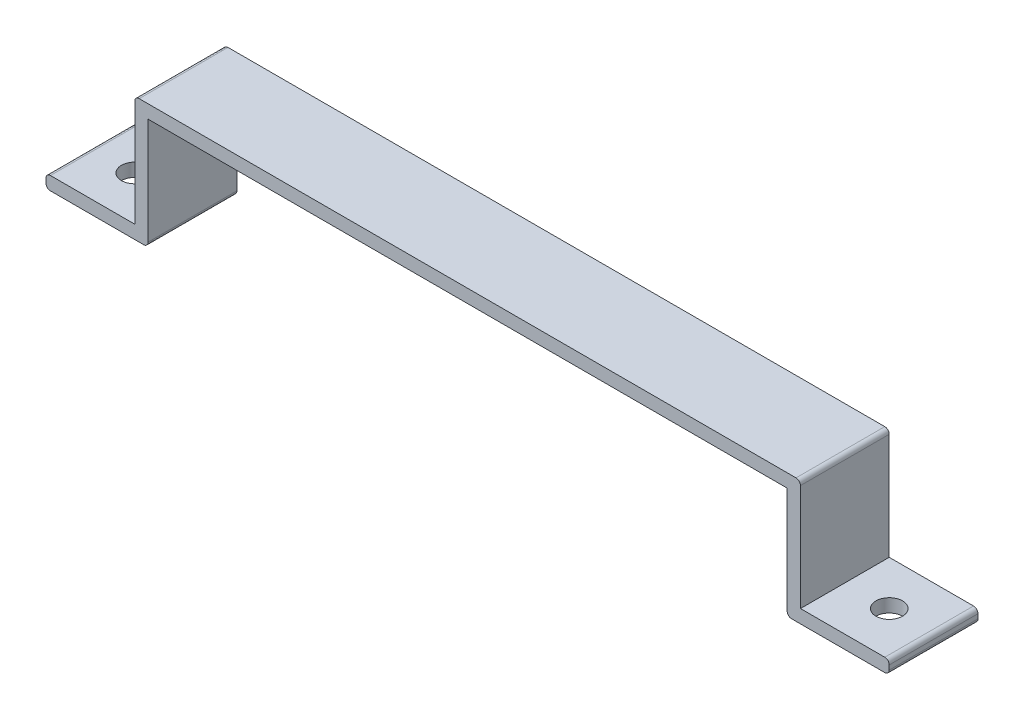
ISO-10303-21;
HEADER;
FILE_DESCRIPTION(('STEP AP214'),'2;1');
FILE_NAME('part.step','',(''),(''),'','','');
FILE_SCHEMA(('AUTOMOTIVE_DESIGN { 1 0 10303 214 1 1 1 1 }'));
ENDSEC;
DATA;
#1=APPLICATION_CONTEXT('core data for automotive mechanical design processes');
#2=APPLICATION_PROTOCOL_DEFINITION('international standard','automotive_design',2000,#1);
#3=PRODUCT_CONTEXT('',#1,'mechanical');
#4=PRODUCT('Part','Part','',(#3));
#5=PRODUCT_RELATED_PRODUCT_CATEGORY('part','',(#4));
#6=PRODUCT_DEFINITION_FORMATION('','',#4);
#7=PRODUCT_DEFINITION_CONTEXT('part definition',#1,'design');
#8=PRODUCT_DEFINITION('design','',#6,#7);
#9=PRODUCT_DEFINITION_SHAPE('','',#8);
#10=(LENGTH_UNIT() NAMED_UNIT(*) SI_UNIT(.MILLI.,.METRE.));
#11=(NAMED_UNIT(*) PLANE_ANGLE_UNIT() SI_UNIT($,.RADIAN.));
#12=(NAMED_UNIT(*) SI_UNIT($,.STERADIAN.) SOLID_ANGLE_UNIT());
#13=UNCERTAINTY_MEASURE_WITH_UNIT(LENGTH_MEASURE(1.E-05),#10,'distance_accuracy_value','');
#14=(GEOMETRIC_REPRESENTATION_CONTEXT(3) GLOBAL_UNCERTAINTY_ASSIGNED_CONTEXT((#13)) GLOBAL_UNIT_ASSIGNED_CONTEXT((#10,
#11,#12)) REPRESENTATION_CONTEXT('',''));
#15=CARTESIAN_POINT('',(0.,0.,0.));
#16=DIRECTION('',(0.,0.,1.));
#17=DIRECTION('',(1.,0.,0.));
#18=AXIS2_PLACEMENT_3D('',#15,#16,#17);
#19=CARTESIAN_POINT('',(170.,-3.,20.));
#20=DIRECTION('',(0.,1.,0.));
#21=DIRECTION('',(0.,0.,1.));
#22=AXIS2_PLACEMENT_3D('',#19,#20,#21);
#23=PLANE('',#22);
#24=CARTESIAN_POINT('',(180.,-3.,10.));
#25=DIRECTION('',(0.,1.,0.));
#26=DIRECTION('',(0.,0.,1.));
#27=AXIS2_PLACEMENT_3D('',#24,#25,#26);
#28=CIRCLE('',#27,2.99999999999999);
#29=CARTESIAN_POINT('',(180.,-3.,13.));
#30=VERTEX_POINT('',#29);
#31=EDGE_CURVE('E514',#30,#30,#28,.F.);
#32=ORIENTED_EDGE('',*,*,#31,.F.);
#33=EDGE_LOOP('',(#32));
#34=FACE_BOUND('',#33,.T.);
#35=DIRECTION('',(1.,0.,0.));
#36=VECTOR('',#35,1.);
#37=CARTESIAN_POINT('',(170.,-3.,0.));
#38=LINE('',#37,#36);
#39=CARTESIAN_POINT('',(168.,-3.,0.));
#40=VERTEX_POINT('',#39);
#41=CARTESIAN_POINT('',(189.,-3.,0.));
#42=VERTEX_POINT('',#41);
#43=EDGE_CURVE('E246',#40,#42,#38,.T.);
#44=ORIENTED_EDGE('',*,*,#43,.T.);
#45=DIRECTION('',(0.,0.,-1.));
#46=VECTOR('',#45,1.);
#47=CARTESIAN_POINT('',(189.,-3.,20.));
#48=LINE('',#47,#46);
#49=CARTESIAN_POINT('',(189.,-3.,20.));
#50=VERTEX_POINT('',#49);
#51=EDGE_CURVE('E374',#42,#50,#48,.F.);
#52=ORIENTED_EDGE('',*,*,#51,.T.);
#53=DIRECTION('',(1.,0.,0.));
#54=VECTOR('',#53,1.);
#55=CARTESIAN_POINT('',(170.,-3.,20.));
#56=LINE('',#55,#54);
#57=CARTESIAN_POINT('',(168.,-3.,20.));
#58=VERTEX_POINT('',#57);
#59=EDGE_CURVE('E215',#58,#50,#56,.T.);
#60=ORIENTED_EDGE('',*,*,#59,.F.);
#61=DIRECTION('',(0.,0.,-1.));
#62=VECTOR('',#61,1.);
#63=CARTESIAN_POINT('',(168.,-3.,20.));
#64=LINE('',#63,#62);
#65=EDGE_CURVE('E370',#58,#40,#64,.T.);
#66=ORIENTED_EDGE('',*,*,#65,.T.);
#67=EDGE_LOOP('',(#44,#52,#60,#66));
#68=FACE_BOUND('',#67,.T.);
#69=ADVANCED_FACE('F39',(#34,#68),#23,.F.);
#70=CARTESIAN_POINT('',(190.,0.,20.));
#71=DIRECTION('',(1.,0.,0.));
#72=DIRECTION('',(0.,0.,-1.));
#73=AXIS2_PLACEMENT_3D('',#70,#71,#72);
#74=PLANE('',#73);
#75=DIRECTION('',(0.,-1.,0.));
#76=VECTOR('',#75,1.);
#77=CARTESIAN_POINT('',(190.,0.,0.));
#78=LINE('',#77,#76);
#79=CARTESIAN_POINT('',(190.,-1.,0.));
#80=VERTEX_POINT('',#79);
#81=CARTESIAN_POINT('',(190.,-2.,0.));
#82=VERTEX_POINT('',#81);
#83=EDGE_CURVE('E250',#80,#82,#78,.T.);
#84=ORIENTED_EDGE('',*,*,#83,.F.);
#85=DIRECTION('',(0.,0.,-1.));
#86=VECTOR('',#85,1.);
#87=CARTESIAN_POINT('',(190.,-1.,20.));
#88=LINE('',#87,#86);
#89=CARTESIAN_POINT('',(190.,-1.,20.));
#90=VERTEX_POINT('',#89);
#91=EDGE_CURVE('E367',#80,#90,#88,.F.);
#92=ORIENTED_EDGE('',*,*,#91,.T.);
#93=DIRECTION('',(0.,-1.,0.));
#94=VECTOR('',#93,1.);
#95=CARTESIAN_POINT('',(190.,0.,20.));
#96=LINE('',#95,#94);
#97=CARTESIAN_POINT('',(190.,-2.,20.));
#98=VERTEX_POINT('',#97);
#99=EDGE_CURVE('E211',#90,#98,#96,.T.);
#100=ORIENTED_EDGE('',*,*,#99,.T.);
#101=DIRECTION('',(0.,0.,-1.));
#102=VECTOR('',#101,1.);
#103=CARTESIAN_POINT('',(190.,-2.,0.));
#104=LINE('',#103,#102);
#105=EDGE_CURVE('E363',#98,#82,#104,.T.);
#106=ORIENTED_EDGE('',*,*,#105,.T.);
#107=EDGE_LOOP('',(#84,#92,#100,#106));
#108=FACE_BOUND('',#107,.T.);
#109=ADVANCED_FACE('F426',(#108),#74,.T.);
#110=CARTESIAN_POINT('',(170.,0.,20.));
#111=DIRECTION('',(0.,1.,0.));
#112=DIRECTION('',(0.,0.,1.));
#113=AXIS2_PLACEMENT_3D('',#110,#111,#112);
#114=PLANE('',#113);
#115=CARTESIAN_POINT('',(180.,0.,10.));
#116=DIRECTION('',(0.,1.,0.));
#117=DIRECTION('',(0.,0.,1.));
#118=AXIS2_PLACEMENT_3D('',#115,#116,#117);
#119=CIRCLE('',#118,2.99999999999999);
#120=CARTESIAN_POINT('',(180.,0.,13.));
#121=VERTEX_POINT('',#120);
#122=EDGE_CURVE('E511',#121,#121,#119,.T.);
#123=ORIENTED_EDGE('',*,*,#122,.F.);
#124=EDGE_LOOP('',(#123));
#125=FACE_BOUND('',#124,.T.);
#126=DIRECTION('',(1.,0.,0.));
#127=VECTOR('',#126,1.);
#128=CARTESIAN_POINT('',(170.,0.,20.));
#129=LINE('',#128,#127);
#130=CARTESIAN_POINT('',(170.,0.,20.));
#131=VERTEX_POINT('',#130);
#132=CARTESIAN_POINT('',(189.,0.,20.));
#133=VERTEX_POINT('',#132);
#134=EDGE_CURVE('E192',#131,#133,#129,.T.);
#135=ORIENTED_EDGE('',*,*,#134,.T.);
#136=DIRECTION('',(0.,0.,-1.));
#137=VECTOR('',#136,1.);
#138=CARTESIAN_POINT('',(189.,0.,20.));
#139=LINE('',#138,#137);
#140=CARTESIAN_POINT('',(189.,0.,0.));
#141=VERTEX_POINT('',#140);
#142=EDGE_CURVE('E360',#133,#141,#139,.T.);
#143=ORIENTED_EDGE('',*,*,#142,.T.);
#144=DIRECTION('',(1.,0.,0.));
#145=VECTOR('',#144,1.);
#146=CARTESIAN_POINT('',(170.,0.,0.));
#147=LINE('',#146,#145);
#148=CARTESIAN_POINT('',(170.,0.,0.));
#149=VERTEX_POINT('',#148);
#150=EDGE_CURVE('E200',#149,#141,#147,.T.);
#151=ORIENTED_EDGE('',*,*,#150,.F.);
#152=DIRECTION('',(0.,0.,-1.));
#153=VECTOR('',#152,1.);
#154=CARTESIAN_POINT('',(170.,0.,20.));
#155=LINE('',#154,#153);
#156=EDGE_CURVE('E184',#131,#149,#155,.T.);
#157=ORIENTED_EDGE('',*,*,#156,.F.);
#158=EDGE_LOOP('',(#135,#143,#151,#157));
#159=FACE_BOUND('',#158,.T.);
#160=ADVANCED_FACE('F196',(#125,#159),#114,.T.);
#161=CARTESIAN_POINT('',(170.,25.,20.));
#162=DIRECTION('',(1.,0.,0.));
#163=DIRECTION('',(0.,0.,-1.));
#164=AXIS2_PLACEMENT_3D('',#161,#162,#163);
#165=PLANE('',#164);
#166=DIRECTION('',(0.,-1.,0.));
#167=VECTOR('',#166,1.);
#168=CARTESIAN_POINT('',(170.,25.,0.));
#169=LINE('',#168,#167);
#170=CARTESIAN_POINT('',(170.,24.,0.));
#171=VERTEX_POINT('',#170);
#172=EDGE_CURVE('E257',#171,#149,#169,.T.);
#173=ORIENTED_EDGE('',*,*,#172,.F.);
#174=DIRECTION('',(0.,0.,-1.));
#175=VECTOR('',#174,1.);
#176=CARTESIAN_POINT('',(170.,24.,20.));
#177=LINE('',#176,#175);
#178=CARTESIAN_POINT('',(170.,24.,20.));
#179=VERTEX_POINT('',#178);
#180=EDGE_CURVE('E187',#171,#179,#177,.F.);
#181=ORIENTED_EDGE('',*,*,#180,.T.);
#182=DIRECTION('',(0.,-1.,0.));
#183=VECTOR('',#182,1.);
#184=CARTESIAN_POINT('',(170.,25.,20.));
#185=LINE('',#184,#183);
#186=EDGE_CURVE('E180',#179,#131,#185,.T.);
#187=ORIENTED_EDGE('',*,*,#186,.T.);
#188=ORIENTED_EDGE('',*,*,#156,.T.);
#189=EDGE_LOOP('',(#173,#181,#187,#188));
#190=FACE_BOUND('',#189,.T.);
#191=ADVANCED_FACE('F183',(#190),#165,.T.);
#192=CARTESIAN_POINT('',(20.,25.,20.));
#193=DIRECTION('',(0.,1.,0.));
#194=DIRECTION('',(0.,0.,1.));
#195=AXIS2_PLACEMENT_3D('',#192,#193,#194);
#196=PLANE('',#195);
#197=DIRECTION('',(1.,0.,0.));
#198=VECTOR('',#197,1.);
#199=CARTESIAN_POINT('',(20.,25.,20.));
#200=LINE('',#199,#198);
#201=CARTESIAN_POINT('',(21.,25.,20.));
#202=VERTEX_POINT('',#201);
#203=CARTESIAN_POINT('',(169.,25.,20.));
#204=VERTEX_POINT('',#203);
#205=EDGE_CURVE('E191',#202,#204,#200,.T.);
#206=ORIENTED_EDGE('',*,*,#205,.T.);
#207=DIRECTION('',(0.,0.,-1.));
#208=VECTOR('',#207,1.);
#209=CARTESIAN_POINT('',(169.,25.,20.));
#210=LINE('',#209,#208);
#211=CARTESIAN_POINT('',(169.,25.,0.));
#212=VERTEX_POINT('',#211);
#213=EDGE_CURVE('E382',#204,#212,#210,.T.);
#214=ORIENTED_EDGE('',*,*,#213,.T.);
#215=DIRECTION('',(1.,0.,0.));
#216=VECTOR('',#215,1.);
#217=CARTESIAN_POINT('',(20.,25.,0.));
#218=LINE('',#217,#216);
#219=CARTESIAN_POINT('',(21.,25.,0.));
#220=VERTEX_POINT('',#219);
#221=EDGE_CURVE('E260',#220,#212,#218,.T.);
#222=ORIENTED_EDGE('',*,*,#221,.F.);
#223=DIRECTION('',(0.,0.,-1.));
#224=VECTOR('',#223,1.);
#225=CARTESIAN_POINT('',(21.,25.,20.));
#226=LINE('',#225,#224);
#227=EDGE_CURVE('E379',#220,#202,#226,.F.);
#228=ORIENTED_EDGE('',*,*,#227,.T.);
#229=EDGE_LOOP('',(#206,#214,#222,#228));
#230=FACE_BOUND('',#229,.T.);
#231=ADVANCED_FACE('F411',(#230),#196,.T.);
#232=CARTESIAN_POINT('',(20.,0.,20.));
#233=DIRECTION('',(-1.,0.,0.));
#234=DIRECTION('',(0.,0.,1.));
#235=AXIS2_PLACEMENT_3D('',#232,#233,#234);
#236=PLANE('',#235);
#237=DIRECTION('',(0.,1.,0.));
#238=VECTOR('',#237,1.);
#239=CARTESIAN_POINT('',(20.,0.,20.));
#240=LINE('',#239,#238);
#241=CARTESIAN_POINT('',(20.,0.,20.));
#242=VERTEX_POINT('',#241);
#243=CARTESIAN_POINT('',(20.,24.,20.));
#244=VERTEX_POINT('',#243);
#245=EDGE_CURVE('E222',#242,#244,#240,.T.);
#246=ORIENTED_EDGE('',*,*,#245,.T.);
#247=DIRECTION('',(0.,0.,-1.));
#248=VECTOR('',#247,1.);
#249=CARTESIAN_POINT('',(20.,24.,20.));
#250=LINE('',#249,#248);
#251=CARTESIAN_POINT('',(20.,24.,0.));
#252=VERTEX_POINT('',#251);
#253=EDGE_CURVE('E48',#244,#252,#250,.T.);
#254=ORIENTED_EDGE('',*,*,#253,.T.);
#255=DIRECTION('',(0.,1.,0.));
#256=VECTOR('',#255,1.);
#257=CARTESIAN_POINT('',(20.,0.,0.));
#258=LINE('',#257,#256);
#259=CARTESIAN_POINT('',(20.,0.,0.));
#260=VERTEX_POINT('',#259);
#261=EDGE_CURVE('E264',#260,#252,#258,.T.);
#262=ORIENTED_EDGE('',*,*,#261,.F.);
#263=DIRECTION('',(0.,0.,-1.));
#264=VECTOR('',#263,1.);
#265=CARTESIAN_POINT('',(20.,0.,20.));
#266=LINE('',#265,#264);
#267=EDGE_CURVE('E203',#242,#260,#266,.T.);
#268=ORIENTED_EDGE('',*,*,#267,.F.);
#269=EDGE_LOOP('',(#246,#254,#262,#268));
#270=FACE_BOUND('',#269,.T.);
#271=ADVANCED_FACE('F392',(#270),#236,.T.);
#272=CARTESIAN_POINT('',(0.,0.,20.));
#273=DIRECTION('',(0.,1.,0.));
#274=DIRECTION('',(0.,0.,1.));
#275=AXIS2_PLACEMENT_3D('',#272,#273,#274);
#276=PLANE('',#275);
#277=CARTESIAN_POINT('',(10.,0.,10.));
#278=DIRECTION('',(0.,1.,0.));
#279=DIRECTION('',(0.,0.,1.));
#280=AXIS2_PLACEMENT_3D('',#277,#278,#279);
#281=CIRCLE('',#280,3.);
#282=CARTESIAN_POINT('',(10.,0.,13.));
#283=VERTEX_POINT('',#282);
#284=EDGE_CURVE('E518',#283,#283,#281,.T.);
#285=ORIENTED_EDGE('',*,*,#284,.F.);
#286=EDGE_LOOP('',(#285));
#287=FACE_BOUND('',#286,.T.);
#288=DIRECTION('',(1.,0.,0.));
#289=VECTOR('',#288,1.);
#290=CARTESIAN_POINT('',(0.,0.,0.));
#291=LINE('',#290,#289);
#292=CARTESIAN_POINT('',(1.,0.,0.));
#293=VERTEX_POINT('',#292);
#294=EDGE_CURVE('E268',#293,#260,#291,.T.);
#295=ORIENTED_EDGE('',*,*,#294,.F.);
#296=DIRECTION('',(0.,0.,-1.));
#297=VECTOR('',#296,1.);
#298=CARTESIAN_POINT('',(1.,0.,20.));
#299=LINE('',#298,#297);
#300=CARTESIAN_POINT('',(1.,0.,20.));
#301=VERTEX_POINT('',#300);
#302=EDGE_CURVE('E357',#293,#301,#299,.F.);
#303=ORIENTED_EDGE('',*,*,#302,.T.);
#304=DIRECTION('',(1.,0.,0.));
#305=VECTOR('',#304,1.);
#306=CARTESIAN_POINT('',(0.,0.,20.));
#307=LINE('',#306,#305);
#308=EDGE_CURVE('E226',#301,#242,#307,.T.);
#309=ORIENTED_EDGE('',*,*,#308,.T.);
#310=ORIENTED_EDGE('',*,*,#267,.T.);
#311=EDGE_LOOP('',(#295,#303,#309,#310));
#312=FACE_BOUND('',#311,.T.);
#313=ADVANCED_FACE('F404',(#287,#312),#276,.T.);
#314=CARTESIAN_POINT('',(0.,-3.,20.));
#315=DIRECTION('',(-1.,0.,0.));
#316=DIRECTION('',(0.,0.,1.));
#317=AXIS2_PLACEMENT_3D('',#314,#315,#316);
#318=PLANE('',#317);
#319=DIRECTION('',(0.,1.,0.));
#320=VECTOR('',#319,1.);
#321=CARTESIAN_POINT('',(0.,-3.,0.));
#322=LINE('',#321,#320);
#323=CARTESIAN_POINT('',(0.,-2.,0.));
#324=VERTEX_POINT('',#323);
#325=CARTESIAN_POINT('',(0.,-1.,0.));
#326=VERTEX_POINT('',#325);
#327=EDGE_CURVE('E271',#324,#326,#322,.T.);
#328=ORIENTED_EDGE('',*,*,#327,.F.);
#329=DIRECTION('',(0.,0.,-1.));
#330=VECTOR('',#329,1.);
#331=CARTESIAN_POINT('',(0.,-2.,20.));
#332=LINE('',#331,#330);
#333=CARTESIAN_POINT('',(0.,-2.,20.));
#334=VERTEX_POINT('',#333);
#335=EDGE_CURVE('E332',#324,#334,#332,.F.);
#336=ORIENTED_EDGE('',*,*,#335,.T.);
#337=DIRECTION('',(0.,1.,0.));
#338=VECTOR('',#337,1.);
#339=CARTESIAN_POINT('',(0.,-3.,20.));
#340=LINE('',#339,#338);
#341=CARTESIAN_POINT('',(0.,-1.,20.));
#342=VERTEX_POINT('',#341);
#343=EDGE_CURVE('E229',#334,#342,#340,.T.);
#344=ORIENTED_EDGE('',*,*,#343,.T.);
#345=DIRECTION('',(0.,0.,-1.));
#346=VECTOR('',#345,1.);
#347=CARTESIAN_POINT('',(0.,-1.,20.));
#348=LINE('',#347,#346);
#349=EDGE_CURVE('E328',#342,#326,#348,.T.);
#350=ORIENTED_EDGE('',*,*,#349,.T.);
#351=EDGE_LOOP('',(#328,#336,#344,#350));
#352=FACE_BOUND('',#351,.T.);
#353=ADVANCED_FACE('F486',(#352),#318,.T.);
#354=CARTESIAN_POINT('',(0.,-3.,20.));
#355=DIRECTION('',(0.,1.,0.));
#356=DIRECTION('',(0.,0.,1.));
#357=AXIS2_PLACEMENT_3D('',#354,#355,#356);
#358=PLANE('',#357);
#359=CARTESIAN_POINT('',(10.,-3.,10.));
#360=DIRECTION('',(0.,1.,0.));
#361=DIRECTION('',(0.,0.,1.));
#362=AXIS2_PLACEMENT_3D('',#359,#360,#361);
#363=CIRCLE('',#362,3.);
#364=CARTESIAN_POINT('',(10.,-3.,13.));
#365=VERTEX_POINT('',#364);
#366=EDGE_CURVE('E251',#365,#365,#363,.F.);
#367=ORIENTED_EDGE('',*,*,#366,.F.);
#368=EDGE_LOOP('',(#367));
#369=FACE_BOUND('',#368,.T.);
#370=DIRECTION('',(1.,0.,0.));
#371=VECTOR('',#370,1.);
#372=CARTESIAN_POINT('',(0.,-3.,20.));
#373=LINE('',#372,#371);
#374=CARTESIAN_POINT('',(1.,-3.,20.));
#375=VERTEX_POINT('',#374);
#376=CARTESIAN_POINT('',(22.,-3.,20.));
#377=VERTEX_POINT('',#376);
#378=EDGE_CURVE('E233',#375,#377,#373,.T.);
#379=ORIENTED_EDGE('',*,*,#378,.F.);
#380=DIRECTION('',(0.,0.,-1.));
#381=VECTOR('',#380,1.);
#382=CARTESIAN_POINT('',(1.,-3.,0.));
#383=LINE('',#382,#381);
#384=CARTESIAN_POINT('',(1.,-3.,0.));
#385=VERTEX_POINT('',#384);
#386=EDGE_CURVE('E300',#375,#385,#383,.T.);
#387=ORIENTED_EDGE('',*,*,#386,.T.);
#388=DIRECTION('',(1.,0.,0.));
#389=VECTOR('',#388,1.);
#390=CARTESIAN_POINT('',(0.,-3.,0.));
#391=LINE('',#390,#389);
#392=CARTESIAN_POINT('',(22.,-3.,0.));
#393=VERTEX_POINT('',#392);
#394=EDGE_CURVE('E275',#385,#393,#391,.T.);
#395=ORIENTED_EDGE('',*,*,#394,.T.);
#396=DIRECTION('',(0.,0.,-1.));
#397=VECTOR('',#396,1.);
#398=CARTESIAN_POINT('',(22.,-3.,20.));
#399=LINE('',#398,#397);
#400=EDGE_CURVE('E202',#393,#377,#399,.F.);
#401=ORIENTED_EDGE('',*,*,#400,.T.);
#402=EDGE_LOOP('',(#379,#387,#395,#401));
#403=FACE_BOUND('',#402,.T.);
#404=ADVANCED_FACE('F480',(#369,#403),#358,.F.);
#405=CARTESIAN_POINT('',(23.,0.,20.));
#406=DIRECTION('',(-1.,0.,0.));
#407=DIRECTION('',(0.,0.,1.));
#408=AXIS2_PLACEMENT_3D('',#405,#406,#407);
#409=PLANE('',#408);
#410=DIRECTION('',(0.,1.,0.));
#411=VECTOR('',#410,1.);
#412=CARTESIAN_POINT('',(23.,0.,20.));
#413=LINE('',#412,#411);
#414=CARTESIAN_POINT('',(23.,-2.,20.));
#415=VERTEX_POINT('',#414);
#416=CARTESIAN_POINT('',(23.,22.,20.));
#417=VERTEX_POINT('',#416);
#418=EDGE_CURVE('E236',#415,#417,#413,.T.);
#419=ORIENTED_EDGE('',*,*,#418,.F.);
#420=DIRECTION('',(0.,0.,-1.));
#421=VECTOR('',#420,1.);
#422=CARTESIAN_POINT('',(23.,-2.,20.));
#423=LINE('',#422,#421);
#424=CARTESIAN_POINT('',(23.,-2.,0.));
#425=VERTEX_POINT('',#424);
#426=EDGE_CURVE('E11',#415,#425,#423,.T.);
#427=ORIENTED_EDGE('',*,*,#426,.T.);
#428=DIRECTION('',(0.,1.,0.));
#429=VECTOR('',#428,1.);
#430=CARTESIAN_POINT('',(23.,0.,0.));
#431=LINE('',#430,#429);
#432=CARTESIAN_POINT('',(23.,22.,0.));
#433=VERTEX_POINT('',#432);
#434=EDGE_CURVE('E279',#425,#433,#431,.T.);
#435=ORIENTED_EDGE('',*,*,#434,.T.);
#436=DIRECTION('',(0.,0.,-1.));
#437=VECTOR('',#436,1.);
#438=CARTESIAN_POINT('',(23.,22.,20.));
#439=LINE('',#438,#437);
#440=EDGE_CURVE('E291',#417,#433,#439,.T.);
#441=ORIENTED_EDGE('',*,*,#440,.F.);
#442=EDGE_LOOP('',(#419,#427,#435,#441));
#443=FACE_BOUND('',#442,.T.);
#444=ADVANCED_FACE('F474',(#443),#409,.F.);
#445=CARTESIAN_POINT('',(20.,22.,20.));
#446=DIRECTION('',(0.,1.,0.));
#447=DIRECTION('',(0.,0.,1.));
#448=AXIS2_PLACEMENT_3D('',#445,#446,#447);
#449=PLANE('',#448);
#450=DIRECTION('',(1.,0.,0.));
#451=VECTOR('',#450,1.);
#452=CARTESIAN_POINT('',(20.,22.,0.));
#453=LINE('',#452,#451);
#454=CARTESIAN_POINT('',(167.,22.,0.));
#455=VERTEX_POINT('',#454);
#456=EDGE_CURVE('E282',#433,#455,#453,.T.);
#457=ORIENTED_EDGE('',*,*,#456,.T.);
#458=DIRECTION('',(0.,0.,-1.));
#459=VECTOR('',#458,1.);
#460=CARTESIAN_POINT('',(167.,22.,20.));
#461=LINE('',#460,#459);
#462=CARTESIAN_POINT('',(167.,22.,20.));
#463=VERTEX_POINT('',#462);
#464=EDGE_CURVE('E245',#463,#455,#461,.T.);
#465=ORIENTED_EDGE('',*,*,#464,.F.);
#466=DIRECTION('',(1.,0.,0.));
#467=VECTOR('',#466,1.);
#468=CARTESIAN_POINT('',(20.,22.,20.));
#469=LINE('',#468,#467);
#470=EDGE_CURVE('E239',#417,#463,#469,.T.);
#471=ORIENTED_EDGE('',*,*,#470,.F.);
#472=ORIENTED_EDGE('',*,*,#440,.T.);
#473=EDGE_LOOP('',(#457,#465,#471,#472));
#474=FACE_BOUND('',#473,.T.);
#475=ADVANCED_FACE('F470',(#474),#449,.F.);
#476=CARTESIAN_POINT('',(167.,25.,20.));
#477=DIRECTION('',(1.,0.,0.));
#478=DIRECTION('',(0.,0.,-1.));
#479=AXIS2_PLACEMENT_3D('',#476,#477,#478);
#480=PLANE('',#479);
#481=DIRECTION('',(0.,1.,0.));
#482=VECTOR('',#481,1.);
#483=CARTESIAN_POINT('',(167.,25.,0.));
#484=LINE('',#483,#482);
#485=CARTESIAN_POINT('',(167.,-2.,0.));
#486=VERTEX_POINT('',#485);
#487=EDGE_CURVE('E285',#455,#486,#484,.F.);
#488=ORIENTED_EDGE('',*,*,#487,.T.);
#489=DIRECTION('',(0.,0.,-1.));
#490=VECTOR('',#489,1.);
#491=CARTESIAN_POINT('',(167.,-2.,20.));
#492=LINE('',#491,#490);
#493=CARTESIAN_POINT('',(167.,-2.,20.));
#494=VERTEX_POINT('',#493);
#495=EDGE_CURVE('E55',#486,#494,#492,.F.);
#496=ORIENTED_EDGE('',*,*,#495,.T.);
#497=DIRECTION('',(0.,1.,0.));
#498=VECTOR('',#497,1.);
#499=CARTESIAN_POINT('',(167.,25.,20.));
#500=LINE('',#499,#498);
#501=EDGE_CURVE('E242',#463,#494,#500,.F.);
#502=ORIENTED_EDGE('',*,*,#501,.F.);
#503=ORIENTED_EDGE('',*,*,#464,.T.);
#504=EDGE_LOOP('',(#488,#496,#502,#503));
#505=FACE_BOUND('',#504,.T.);
#506=ADVANCED_FACE('F466',(#505),#480,.F.);
#507=CARTESIAN_POINT('',(0.,0.,20.));
#508=DIRECTION('',(0.,0.,-1.));
#509=DIRECTION('',(-1.,0.,0.));
#510=AXIS2_PLACEMENT_3D('',#507,#508,#509);
#511=PLANE('',#510);
#512=ORIENTED_EDGE('',*,*,#343,.F.);
#513=CARTESIAN_POINT('',(1.,-2.,20.));
#514=DIRECTION('',(0.,0.,-1.));
#515=DIRECTION('',(-1.,0.,0.));
#516=AXIS2_PLACEMENT_3D('',#513,#514,#515);
#517=CIRCLE('',#516,1.);
#518=EDGE_CURVE('E354',#334,#375,#517,.F.);
#519=ORIENTED_EDGE('',*,*,#518,.T.);
#520=ORIENTED_EDGE('',*,*,#378,.T.);
#521=CARTESIAN_POINT('',(22.,-2.,20.));
#522=DIRECTION('',(0.,0.,-1.));
#523=DIRECTION('',(-1.,0.,0.));
#524=AXIS2_PLACEMENT_3D('',#521,#522,#523);
#525=CIRCLE('',#524,1.);
#526=EDGE_CURVE('E63',#377,#415,#525,.F.);
#527=ORIENTED_EDGE('',*,*,#526,.T.);
#528=ORIENTED_EDGE('',*,*,#418,.T.);
#529=ORIENTED_EDGE('',*,*,#470,.T.);
#530=ORIENTED_EDGE('',*,*,#501,.T.);
#531=CARTESIAN_POINT('',(168.,-2.,20.));
#532=DIRECTION('',(0.,0.,-1.));
#533=DIRECTION('',(-1.,0.,0.));
#534=AXIS2_PLACEMENT_3D('',#531,#532,#533);
#535=CIRCLE('',#534,1.);
#536=EDGE_CURVE('E343',#494,#58,#535,.F.);
#537=ORIENTED_EDGE('',*,*,#536,.T.);
#538=ORIENTED_EDGE('',*,*,#59,.T.);
#539=CARTESIAN_POINT('',(189.,-2.,20.));
#540=DIRECTION('',(0.,0.,-1.));
#541=DIRECTION('',(-1.,0.,0.));
#542=AXIS2_PLACEMENT_3D('',#539,#540,#541);
#543=CIRCLE('',#542,1.);
#544=EDGE_CURVE('E346',#50,#98,#543,.F.);
#545=ORIENTED_EDGE('',*,*,#544,.T.);
#546=ORIENTED_EDGE('',*,*,#99,.F.);
#547=CARTESIAN_POINT('',(189.,-1.,20.));
#548=DIRECTION('',(0.,0.,-1.));
#549=DIRECTION('',(-1.,0.,0.));
#550=AXIS2_PLACEMENT_3D('',#547,#548,#549);
#551=CIRCLE('',#550,1.);
#552=EDGE_CURVE('E209',#90,#133,#551,.F.);
#553=ORIENTED_EDGE('',*,*,#552,.T.);
#554=ORIENTED_EDGE('',*,*,#134,.F.);
#555=ORIENTED_EDGE('',*,*,#186,.F.);
#556=CARTESIAN_POINT('',(169.,24.,20.));
#557=DIRECTION('',(0.,0.,-1.));
#558=DIRECTION('',(-1.,0.,0.));
#559=AXIS2_PLACEMENT_3D('',#556,#557,#558);
#560=CIRCLE('',#559,1.);
#561=EDGE_CURVE('E340',#179,#204,#560,.F.);
#562=ORIENTED_EDGE('',*,*,#561,.T.);
#563=ORIENTED_EDGE('',*,*,#205,.F.);
#564=CARTESIAN_POINT('',(21.,24.,20.));
#565=DIRECTION('',(0.,0.,-1.));
#566=DIRECTION('',(-1.,0.,0.));
#567=AXIS2_PLACEMENT_3D('',#564,#565,#566);
#568=CIRCLE('',#567,1.);
#569=EDGE_CURVE('E337',#202,#244,#568,.F.);
#570=ORIENTED_EDGE('',*,*,#569,.T.);
#571=ORIENTED_EDGE('',*,*,#245,.F.);
#572=ORIENTED_EDGE('',*,*,#308,.F.);
#573=CARTESIAN_POINT('',(1.,-1.,20.));
#574=DIRECTION('',(0.,0.,-1.));
#575=DIRECTION('',(-1.,0.,0.));
#576=AXIS2_PLACEMENT_3D('',#573,#574,#575);
#577=CIRCLE('',#576,1.);
#578=EDGE_CURVE('E351',#301,#342,#577,.F.);
#579=ORIENTED_EDGE('',*,*,#578,.T.);
#580=EDGE_LOOP('',(#512,#519,#520,#527,#528,#529,#530,#537,#538,#545,#546,#553,#554,#555,#562,
#563,#570,#571,#572,#579));
#581=FACE_BOUND('',#580,.T.);
#582=ADVANCED_FACE('F206',(#581),#511,.F.);
#583=CARTESIAN_POINT('',(0.,0.,0.));
#584=DIRECTION('',(0.,0.,-1.));
#585=DIRECTION('',(-1.,0.,0.));
#586=AXIS2_PLACEMENT_3D('',#583,#584,#585);
#587=PLANE('',#586);
#588=ORIENTED_EDGE('',*,*,#394,.F.);
#589=CARTESIAN_POINT('',(1.,-2.,0.));
#590=DIRECTION('',(0.,0.,-1.));
#591=DIRECTION('',(-1.,0.,0.));
#592=AXIS2_PLACEMENT_3D('',#589,#590,#591);
#593=CIRCLE('',#592,1.);
#594=EDGE_CURVE('E325',#385,#324,#593,.T.);
#595=ORIENTED_EDGE('',*,*,#594,.T.);
#596=ORIENTED_EDGE('',*,*,#327,.T.);
#597=CARTESIAN_POINT('',(1.,-1.,0.));
#598=DIRECTION('',(0.,0.,-1.));
#599=DIRECTION('',(-1.,0.,0.));
#600=AXIS2_PLACEMENT_3D('',#597,#598,#599);
#601=CIRCLE('',#600,1.);
#602=EDGE_CURVE('E322',#326,#293,#601,.T.);
#603=ORIENTED_EDGE('',*,*,#602,.T.);
#604=ORIENTED_EDGE('',*,*,#294,.T.);
#605=ORIENTED_EDGE('',*,*,#261,.T.);
#606=CARTESIAN_POINT('',(21.,24.,0.));
#607=DIRECTION('',(0.,0.,-1.));
#608=DIRECTION('',(-1.,0.,0.));
#609=AXIS2_PLACEMENT_3D('',#606,#607,#608);
#610=CIRCLE('',#609,1.);
#611=EDGE_CURVE('E307',#252,#220,#610,.T.);
#612=ORIENTED_EDGE('',*,*,#611,.T.);
#613=ORIENTED_EDGE('',*,*,#221,.T.);
#614=CARTESIAN_POINT('',(169.,24.,0.));
#615=DIRECTION('',(0.,0.,-1.));
#616=DIRECTION('',(-1.,0.,0.));
#617=AXIS2_PLACEMENT_3D('',#614,#615,#616);
#618=CIRCLE('',#617,1.);
#619=EDGE_CURVE('E310',#212,#171,#618,.T.);
#620=ORIENTED_EDGE('',*,*,#619,.T.);
#621=ORIENTED_EDGE('',*,*,#172,.T.);
#622=ORIENTED_EDGE('',*,*,#150,.T.);
#623=CARTESIAN_POINT('',(189.,-1.,0.));
#624=DIRECTION('',(0.,0.,-1.));
#625=DIRECTION('',(-1.,0.,0.));
#626=AXIS2_PLACEMENT_3D('',#623,#624,#625);
#627=CIRCLE('',#626,1.);
#628=EDGE_CURVE('E319',#141,#80,#627,.T.);
#629=ORIENTED_EDGE('',*,*,#628,.T.);
#630=ORIENTED_EDGE('',*,*,#83,.T.);
#631=CARTESIAN_POINT('',(189.,-2.,0.));
#632=DIRECTION('',(0.,0.,-1.));
#633=DIRECTION('',(-1.,0.,0.));
#634=AXIS2_PLACEMENT_3D('',#631,#632,#633);
#635=CIRCLE('',#634,1.);
#636=EDGE_CURVE('E316',#82,#42,#635,.T.);
#637=ORIENTED_EDGE('',*,*,#636,.T.);
#638=ORIENTED_EDGE('',*,*,#43,.F.);
#639=CARTESIAN_POINT('',(168.,-2.,0.));
#640=DIRECTION('',(0.,0.,-1.));
#641=DIRECTION('',(-1.,0.,0.));
#642=AXIS2_PLACEMENT_3D('',#639,#640,#641);
#643=CIRCLE('',#642,1.);
#644=EDGE_CURVE('E313',#40,#486,#643,.T.);
#645=ORIENTED_EDGE('',*,*,#644,.T.);
#646=ORIENTED_EDGE('',*,*,#487,.F.);
#647=ORIENTED_EDGE('',*,*,#456,.F.);
#648=ORIENTED_EDGE('',*,*,#434,.F.);
#649=CARTESIAN_POINT('',(22.,-2.,0.));
#650=DIRECTION('',(0.,0.,-1.));
#651=DIRECTION('',(-1.,0.,0.));
#652=AXIS2_PLACEMENT_3D('',#649,#650,#651);
#653=CIRCLE('',#652,1.);
#654=EDGE_CURVE('E304',#425,#393,#653,.T.);
#655=ORIENTED_EDGE('',*,*,#654,.T.);
#656=EDGE_LOOP('',(#588,#595,#596,#603,#604,#605,#612,#613,#620,#621,#622,#629,#630,#637,#638,
#645,#646,#647,#648,#655));
#657=FACE_BOUND('',#656,.T.);
#658=ADVANCED_FACE('F399',(#657),#587,.T.);
#659=CARTESIAN_POINT('',(1.,-2.,20.));
#660=DIRECTION('',(0.,0.,1.));
#661=DIRECTION('',(1.,0.,0.));
#662=AXIS2_PLACEMENT_3D('',#659,#660,#661);
#663=CYLINDRICAL_SURFACE('',#662,1.);
#664=ORIENTED_EDGE('',*,*,#518,.F.);
#665=ORIENTED_EDGE('',*,*,#335,.F.);
#666=ORIENTED_EDGE('',*,*,#594,.F.);
#667=ORIENTED_EDGE('',*,*,#386,.F.);
#668=EDGE_LOOP('',(#664,#665,#666,#667));
#669=FACE_BOUND('',#668,.T.);
#670=ADVANCED_FACE('F438',(#669),#663,.T.);
#671=CARTESIAN_POINT('',(1.,-1.,20.));
#672=DIRECTION('',(0.,0.,-1.));
#673=DIRECTION('',(-1.,0.,0.));
#674=AXIS2_PLACEMENT_3D('',#671,#672,#673);
#675=CYLINDRICAL_SURFACE('',#674,1.);
#676=ORIENTED_EDGE('',*,*,#578,.F.);
#677=ORIENTED_EDGE('',*,*,#302,.F.);
#678=ORIENTED_EDGE('',*,*,#602,.F.);
#679=ORIENTED_EDGE('',*,*,#349,.F.);
#680=EDGE_LOOP('',(#676,#677,#678,#679));
#681=FACE_BOUND('',#680,.T.);
#682=ADVANCED_FACE('F441',(#681),#675,.T.);
#683=CARTESIAN_POINT('',(189.,-1.,20.));
#684=DIRECTION('',(0.,0.,-1.));
#685=DIRECTION('',(-1.,0.,0.));
#686=AXIS2_PLACEMENT_3D('',#683,#684,#685);
#687=CYLINDRICAL_SURFACE('',#686,1.);
#688=ORIENTED_EDGE('',*,*,#552,.F.);
#689=ORIENTED_EDGE('',*,*,#91,.F.);
#690=ORIENTED_EDGE('',*,*,#628,.F.);
#691=ORIENTED_EDGE('',*,*,#142,.F.);
#692=EDGE_LOOP('',(#688,#689,#690,#691));
#693=FACE_BOUND('',#692,.T.);
#694=ADVANCED_FACE('F445',(#693),#687,.T.);
#695=CARTESIAN_POINT('',(189.,-2.,20.));
#696=DIRECTION('',(0.,0.,1.));
#697=DIRECTION('',(1.,0.,0.));
#698=AXIS2_PLACEMENT_3D('',#695,#696,#697);
#699=CYLINDRICAL_SURFACE('',#698,1.);
#700=ORIENTED_EDGE('',*,*,#544,.F.);
#701=ORIENTED_EDGE('',*,*,#51,.F.);
#702=ORIENTED_EDGE('',*,*,#636,.F.);
#703=ORIENTED_EDGE('',*,*,#105,.F.);
#704=EDGE_LOOP('',(#700,#701,#702,#703));
#705=FACE_BOUND('',#704,.T.);
#706=ADVANCED_FACE('F422',(#705),#699,.T.);
#707=CARTESIAN_POINT('',(168.,-2.,20.));
#708=DIRECTION('',(0.,0.,-1.));
#709=DIRECTION('',(-1.,0.,0.));
#710=AXIS2_PLACEMENT_3D('',#707,#708,#709);
#711=CYLINDRICAL_SURFACE('',#710,1.);
#712=ORIENTED_EDGE('',*,*,#536,.F.);
#713=ORIENTED_EDGE('',*,*,#495,.F.);
#714=ORIENTED_EDGE('',*,*,#644,.F.);
#715=ORIENTED_EDGE('',*,*,#65,.F.);
#716=EDGE_LOOP('',(#712,#713,#714,#715));
#717=FACE_BOUND('',#716,.T.);
#718=ADVANCED_FACE('F416',(#717),#711,.T.);
#719=CARTESIAN_POINT('',(169.,24.,20.));
#720=DIRECTION('',(0.,0.,-1.));
#721=DIRECTION('',(-1.,0.,0.));
#722=AXIS2_PLACEMENT_3D('',#719,#720,#721);
#723=CYLINDRICAL_SURFACE('',#722,1.);
#724=ORIENTED_EDGE('',*,*,#561,.F.);
#725=ORIENTED_EDGE('',*,*,#180,.F.);
#726=ORIENTED_EDGE('',*,*,#619,.F.);
#727=ORIENTED_EDGE('',*,*,#213,.F.);
#728=EDGE_LOOP('',(#724,#725,#726,#727));
#729=FACE_BOUND('',#728,.T.);
#730=ADVANCED_FACE('F414',(#729),#723,.T.);
#731=CARTESIAN_POINT('',(21.,24.,20.));
#732=DIRECTION('',(0.,0.,-1.));
#733=DIRECTION('',(-1.,0.,0.));
#734=AXIS2_PLACEMENT_3D('',#731,#732,#733);
#735=CYLINDRICAL_SURFACE('',#734,1.);
#736=ORIENTED_EDGE('',*,*,#569,.F.);
#737=ORIENTED_EDGE('',*,*,#227,.F.);
#738=ORIENTED_EDGE('',*,*,#611,.F.);
#739=ORIENTED_EDGE('',*,*,#253,.F.);
#740=EDGE_LOOP('',(#736,#737,#738,#739));
#741=FACE_BOUND('',#740,.T.);
#742=ADVANCED_FACE('F409',(#741),#735,.T.);
#743=CARTESIAN_POINT('',(22.,-2.,20.));
#744=DIRECTION('',(0.,0.,-1.));
#745=DIRECTION('',(-1.,0.,0.));
#746=AXIS2_PLACEMENT_3D('',#743,#744,#745);
#747=CYLINDRICAL_SURFACE('',#746,1.);
#748=ORIENTED_EDGE('',*,*,#526,.F.);
#749=ORIENTED_EDGE('',*,*,#400,.F.);
#750=ORIENTED_EDGE('',*,*,#654,.F.);
#751=ORIENTED_EDGE('',*,*,#426,.F.);
#752=EDGE_LOOP('',(#748,#749,#750,#751));
#753=FACE_BOUND('',#752,.T.);
#754=ADVANCED_FACE('F41',(#753),#747,.T.);
#755=CARTESIAN_POINT('',(10.,-3.001,10.));
#756=DIRECTION('',(0.,1.,0.));
#757=DIRECTION('',(0.,0.,1.));
#758=AXIS2_PLACEMENT_3D('',#755,#756,#757);
#759=CYLINDRICAL_SURFACE('',#758,3.);
#760=CARTESIAN_POINT('',(10.,0.,13.));
#761=CARTESIAN_POINT('',(10.,-0.0312500000000005,13.));
#762=CARTESIAN_POINT('',(10.,-0.0625000000000005,13.));
#763=CARTESIAN_POINT('',(10.,-0.125000000000001,13.));
#764=CARTESIAN_POINT('',(10.,-0.156250000000001,13.));
#765=CARTESIAN_POINT('',(10.,-0.218750000000001,13.));
#766=CARTESIAN_POINT('',(10.,-0.250000000000001,13.));
#767=CARTESIAN_POINT('',(10.,-0.312500000000001,13.));
#768=CARTESIAN_POINT('',(10.,-0.34375,13.));
#769=CARTESIAN_POINT('',(10.,-0.40625,13.));
#770=CARTESIAN_POINT('',(10.,-0.4375,13.));
#771=CARTESIAN_POINT('',(10.,-0.5,13.));
#772=CARTESIAN_POINT('',(10.,-0.53125,13.));
#773=CARTESIAN_POINT('',(10.,-0.593750000000001,13.));
#774=CARTESIAN_POINT('',(10.,-0.625000000000001,13.));
#775=CARTESIAN_POINT('',(10.,-0.687500000000001,13.));
#776=CARTESIAN_POINT('',(10.,-0.71875,13.));
#777=CARTESIAN_POINT('',(10.,-0.78125,13.));
#778=CARTESIAN_POINT('',(10.,-0.8125,13.));
#779=CARTESIAN_POINT('',(10.,-0.875,13.));
#780=CARTESIAN_POINT('',(10.,-0.90625,13.));
#781=CARTESIAN_POINT('',(10.,-0.96875,13.));
#782=CARTESIAN_POINT('',(10.,-1.,13.));
#783=CARTESIAN_POINT('',(10.,-1.0625,13.));
#784=CARTESIAN_POINT('',(10.,-1.09375,13.));
#785=CARTESIAN_POINT('',(10.,-1.15625,13.));
#786=CARTESIAN_POINT('',(10.,-1.1875,13.));
#787=CARTESIAN_POINT('',(10.,-1.25,13.));
#788=CARTESIAN_POINT('',(10.,-1.28125,13.));
#789=CARTESIAN_POINT('',(10.,-1.34375,13.));
#790=CARTESIAN_POINT('',(10.,-1.375,13.));
#791=CARTESIAN_POINT('',(10.,-1.4375,13.));
#792=CARTESIAN_POINT('',(10.,-1.46875,13.));
#793=CARTESIAN_POINT('',(10.,-1.53125,13.));
#794=CARTESIAN_POINT('',(10.,-1.5625,13.));
#795=CARTESIAN_POINT('',(10.,-1.625,13.));
#796=CARTESIAN_POINT('',(10.,-1.65625,13.));
#797=CARTESIAN_POINT('',(10.,-1.71875,13.));
#798=CARTESIAN_POINT('',(10.,-1.75,13.));
#799=CARTESIAN_POINT('',(10.,-1.8125,13.));
#800=CARTESIAN_POINT('',(10.,-1.84375,13.));
#801=CARTESIAN_POINT('',(10.,-1.90625,13.));
#802=CARTESIAN_POINT('',(10.,-1.9375,13.));
#803=CARTESIAN_POINT('',(10.,-2.,13.));
#804=CARTESIAN_POINT('',(10.,-2.03125,13.));
#805=CARTESIAN_POINT('',(10.,-2.09375,13.));
#806=CARTESIAN_POINT('',(10.,-2.125,13.));
#807=CARTESIAN_POINT('',(10.,-2.1875,13.));
#808=CARTESIAN_POINT('',(10.,-2.21875,13.));
#809=CARTESIAN_POINT('',(10.,-2.28125,13.));
#810=CARTESIAN_POINT('',(10.,-2.3125,13.));
#811=CARTESIAN_POINT('',(10.,-2.375,13.));
#812=CARTESIAN_POINT('',(10.,-2.40625,13.));
#813=CARTESIAN_POINT('',(10.,-2.46875,13.));
#814=CARTESIAN_POINT('',(10.,-2.5,13.));
#815=CARTESIAN_POINT('',(10.,-2.5625,13.));
#816=CARTESIAN_POINT('',(10.,-2.59375,13.));
#817=CARTESIAN_POINT('',(10.,-2.65625,13.));
#818=CARTESIAN_POINT('',(10.,-2.6875,13.));
#819=CARTESIAN_POINT('',(10.,-2.75,13.));
#820=CARTESIAN_POINT('',(10.,-2.78125,13.));
#821=CARTESIAN_POINT('',(10.,-2.84375,13.));
#822=CARTESIAN_POINT('',(10.,-2.875,13.));
#823=CARTESIAN_POINT('',(10.,-2.9375,13.));
#824=CARTESIAN_POINT('',(10.,-2.96875,13.));
#825=CARTESIAN_POINT('',(10.,-3.,13.));
#826=B_SPLINE_CURVE_WITH_KNOTS('',3,(#760,#761,#762,#763,#764,#765,#766,#767,#768,#769,#770,
#771,#772,#773,#774,#775,#776,#777,#778,#779,#780,#781,#782,#783,#784,#785,#786,#787,#788,#789,
#790,#791,#792,#793,#794,#795,#796,#797,#798,#799,#800,#801,#802,#803,#804,#805,#806,#807,#808,
#809,#810,#811,#812,#813,#814,#815,#816,#817,#818,#819,#820,#821,#822,#823,#824,#825),
.UNSPECIFIED.,.F.,.F.,(4,2,2,2,2,2,2,2,2,2,2,2,2,2,2,2,2,2,2,2,2,2,2,2,2,2,2,2,2,2,2,2,4),(0.,
0.0937500000000001,0.1875,0.28125,0.375,0.46875,0.5625,0.65625,0.75,0.84375,0.9375,1.03125,
1.125,1.21875,1.3125,1.40625,1.5,1.59375,1.6875,1.78125,1.875,1.96875,2.0625,2.15625,2.25,
2.34375,2.4375,2.53125,2.625,2.71875,2.8125,2.90625,3.),.UNSPECIFIED.);
#827=EDGE_CURVE('BSEAM529',#283,#365,#826,.T.);
#828=ORIENTED_EDGE('',*,*,#284,.T.);
#829=ORIENTED_EDGE('',*,*,#366,.T.);
#830=ORIENTED_EDGE('',*,*,#827,.T.);
#831=ORIENTED_EDGE('',*,*,#827,.F.);
#832=EDGE_LOOP('',(#828,#830,#829,#831));
#833=FACE_BOUND('',#832,.T.);
#834=ADVANCED_FACE('F529',(#833),#759,.F.);
#835=CARTESIAN_POINT('',(180.,-3.001,10.));
#836=DIRECTION('',(0.,1.,0.));
#837=DIRECTION('',(0.,0.,1.));
#838=AXIS2_PLACEMENT_3D('',#835,#836,#837);
#839=CYLINDRICAL_SURFACE('',#838,2.99999999999999);
#840=CARTESIAN_POINT('',(180.,0.,13.));
#841=CARTESIAN_POINT('',(180.,-0.0312500000000005,13.));
#842=CARTESIAN_POINT('',(180.,-0.0625000000000005,13.));
#843=CARTESIAN_POINT('',(180.,-0.125000000000001,13.));
#844=CARTESIAN_POINT('',(180.,-0.156250000000001,13.));
#845=CARTESIAN_POINT('',(180.,-0.218750000000001,13.));
#846=CARTESIAN_POINT('',(180.,-0.250000000000001,13.));
#847=CARTESIAN_POINT('',(180.,-0.312500000000001,13.));
#848=CARTESIAN_POINT('',(180.,-0.34375,13.));
#849=CARTESIAN_POINT('',(180.,-0.40625,13.));
#850=CARTESIAN_POINT('',(180.,-0.4375,13.));
#851=CARTESIAN_POINT('',(180.,-0.5,13.));
#852=CARTESIAN_POINT('',(180.,-0.53125,13.));
#853=CARTESIAN_POINT('',(180.,-0.593750000000001,13.));
#854=CARTESIAN_POINT('',(180.,-0.625000000000001,13.));
#855=CARTESIAN_POINT('',(180.,-0.687500000000001,13.));
#856=CARTESIAN_POINT('',(180.,-0.71875,13.));
#857=CARTESIAN_POINT('',(180.,-0.78125,13.));
#858=CARTESIAN_POINT('',(180.,-0.8125,13.));
#859=CARTESIAN_POINT('',(180.,-0.875,13.));
#860=CARTESIAN_POINT('',(180.,-0.90625,13.));
#861=CARTESIAN_POINT('',(180.,-0.96875,13.));
#862=CARTESIAN_POINT('',(180.,-1.,13.));
#863=CARTESIAN_POINT('',(180.,-1.0625,13.));
#864=CARTESIAN_POINT('',(180.,-1.09375,13.));
#865=CARTESIAN_POINT('',(180.,-1.15625,13.));
#866=CARTESIAN_POINT('',(180.,-1.1875,13.));
#867=CARTESIAN_POINT('',(180.,-1.25,13.));
#868=CARTESIAN_POINT('',(180.,-1.28125,13.));
#869=CARTESIAN_POINT('',(180.,-1.34375,13.));
#870=CARTESIAN_POINT('',(180.,-1.375,13.));
#871=CARTESIAN_POINT('',(180.,-1.4375,13.));
#872=CARTESIAN_POINT('',(180.,-1.46875,13.));
#873=CARTESIAN_POINT('',(180.,-1.53125,13.));
#874=CARTESIAN_POINT('',(180.,-1.5625,13.));
#875=CARTESIAN_POINT('',(180.,-1.625,13.));
#876=CARTESIAN_POINT('',(180.,-1.65625,13.));
#877=CARTESIAN_POINT('',(180.,-1.71875,13.));
#878=CARTESIAN_POINT('',(180.,-1.75,13.));
#879=CARTESIAN_POINT('',(180.,-1.8125,13.));
#880=CARTESIAN_POINT('',(180.,-1.84375,13.));
#881=CARTESIAN_POINT('',(180.,-1.90625,13.));
#882=CARTESIAN_POINT('',(180.,-1.9375,13.));
#883=CARTESIAN_POINT('',(180.,-2.,13.));
#884=CARTESIAN_POINT('',(180.,-2.03125,13.));
#885=CARTESIAN_POINT('',(180.,-2.09375,13.));
#886=CARTESIAN_POINT('',(180.,-2.125,13.));
#887=CARTESIAN_POINT('',(180.,-2.1875,13.));
#888=CARTESIAN_POINT('',(180.,-2.21875,13.));
#889=CARTESIAN_POINT('',(180.,-2.28125,13.));
#890=CARTESIAN_POINT('',(180.,-2.3125,13.));
#891=CARTESIAN_POINT('',(180.,-2.375,13.));
#892=CARTESIAN_POINT('',(180.,-2.40625,13.));
#893=CARTESIAN_POINT('',(180.,-2.46875,13.));
#894=CARTESIAN_POINT('',(180.,-2.5,13.));
#895=CARTESIAN_POINT('',(180.,-2.5625,13.));
#896=CARTESIAN_POINT('',(180.,-2.59375,13.));
#897=CARTESIAN_POINT('',(180.,-2.65625,13.));
#898=CARTESIAN_POINT('',(180.,-2.6875,13.));
#899=CARTESIAN_POINT('',(180.,-2.75,13.));
#900=CARTESIAN_POINT('',(180.,-2.78125,13.));
#901=CARTESIAN_POINT('',(180.,-2.84375,13.));
#902=CARTESIAN_POINT('',(180.,-2.875,13.));
#903=CARTESIAN_POINT('',(180.,-2.9375,13.));
#904=CARTESIAN_POINT('',(180.,-2.96875,13.));
#905=CARTESIAN_POINT('',(180.,-3.,13.));
#906=B_SPLINE_CURVE_WITH_KNOTS('',3,(#840,#841,#842,#843,#844,#845,#846,#847,#848,#849,#850,
#851,#852,#853,#854,#855,#856,#857,#858,#859,#860,#861,#862,#863,#864,#865,#866,#867,#868,#869,
#870,#871,#872,#873,#874,#875,#876,#877,#878,#879,#880,#881,#882,#883,#884,#885,#886,#887,#888,
#889,#890,#891,#892,#893,#894,#895,#896,#897,#898,#899,#900,#901,#902,#903,#904,#905),
.UNSPECIFIED.,.F.,.F.,(4,2,2,2,2,2,2,2,2,2,2,2,2,2,2,2,2,2,2,2,2,2,2,2,2,2,2,2,2,2,2,2,4),(0.,
0.0937500000000001,0.1875,0.28125,0.375,0.46875,0.5625,0.65625,0.75,0.84375,0.9375,1.03125,
1.125,1.21875,1.3125,1.40625,1.5,1.59375,1.6875,1.78125,1.875,1.96875,2.0625,2.15625,2.25,
2.34375,2.4375,2.53125,2.625,2.71875,2.8125,2.90625,3.),.UNSPECIFIED.);
#907=EDGE_CURVE('BSEAM532',#121,#30,#906,.T.);
#908=ORIENTED_EDGE('',*,*,#122,.T.);
#909=ORIENTED_EDGE('',*,*,#31,.T.);
#910=ORIENTED_EDGE('',*,*,#907,.T.);
#911=ORIENTED_EDGE('',*,*,#907,.F.);
#912=EDGE_LOOP('',(#908,#910,#909,#911));
#913=FACE_BOUND('',#912,.T.);
#914=ADVANCED_FACE('F532',(#913),#839,.F.);
#915=CLOSED_SHELL('',(#69,#109,#160,#191,#231,#271,#313,#353,#404,#444,#475,#506,#582,#658,#670,
#682,#694,#706,#718,#730,#742,#754,#834,#914));
#916=MANIFOLD_SOLID_BREP('B2',#915);
#917=ADVANCED_BREP_SHAPE_REPRESENTATION('',(#18,#916),#14);
#918=SHAPE_DEFINITION_REPRESENTATION(#9,#917);
ENDSEC;
END-ISO-10303-21;
